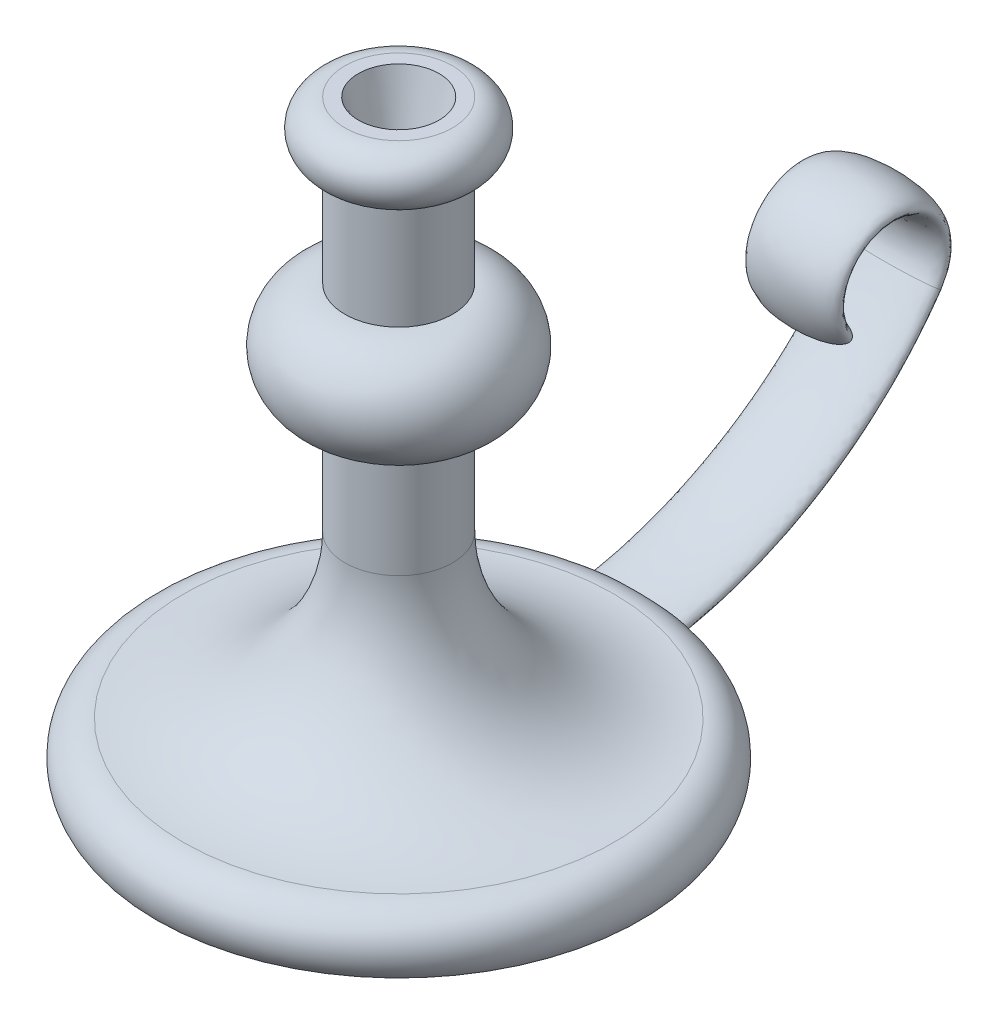
ISO-10303-21;
HEADER;
FILE_DESCRIPTION(('STEP AP214'),'2;1');
FILE_NAME('part.step','',(''),(''),'','','');
FILE_SCHEMA(('AUTOMOTIVE_DESIGN { 1 0 10303 214 1 1 1 1 }'));
ENDSEC;
DATA;
#1=APPLICATION_CONTEXT('core data for automotive mechanical design processes');
#2=APPLICATION_PROTOCOL_DEFINITION('international standard','automotive_design',2000,#1);
#3=PRODUCT_CONTEXT('',#1,'mechanical');
#4=PRODUCT('Part','Part','',(#3));
#5=PRODUCT_RELATED_PRODUCT_CATEGORY('part','',(#4));
#6=PRODUCT_DEFINITION_FORMATION('','',#4);
#7=PRODUCT_DEFINITION_CONTEXT('part definition',#1,'design');
#8=PRODUCT_DEFINITION('design','',#6,#7);
#9=PRODUCT_DEFINITION_SHAPE('','',#8);
#10=(LENGTH_UNIT() NAMED_UNIT(*) SI_UNIT(.MILLI.,.METRE.));
#11=(NAMED_UNIT(*) PLANE_ANGLE_UNIT() SI_UNIT($,.RADIAN.));
#12=(NAMED_UNIT(*) SI_UNIT($,.STERADIAN.) SOLID_ANGLE_UNIT());
#13=UNCERTAINTY_MEASURE_WITH_UNIT(LENGTH_MEASURE(1.E-05),#10,'distance_accuracy_value','');
#14=(GEOMETRIC_REPRESENTATION_CONTEXT(3) GLOBAL_UNCERTAINTY_ASSIGNED_CONTEXT((#13)) GLOBAL_UNIT_ASSIGNED_CONTEXT((#10,
#11,#12)) REPRESENTATION_CONTEXT('',''));
#15=CARTESIAN_POINT('',(0.,0.,0.));
#16=DIRECTION('',(0.,0.,1.));
#17=DIRECTION('',(1.,0.,0.));
#18=AXIS2_PLACEMENT_3D('',#15,#16,#17);
#19=CARTESIAN_POINT('',(0.,7.50000000000003,0.));
#20=DIRECTION('',(0.,-1.,0.));
#21=DIRECTION('',(0.,0.,-1.));
#22=AXIS2_PLACEMENT_3D('',#19,#20,#21);
#23=TOROIDAL_SURFACE('',#22,80.,12.5);
#24=CARTESIAN_POINT('',(0.,0.,0.));
#25=DIRECTION('',(0.,-1.,0.));
#26=DIRECTION('',(0.,0.,-1.));
#27=AXIS2_PLACEMENT_3D('',#24,#25,#26);
#28=CIRCLE('',#27,90.);
#29=CARTESIAN_POINT('',(0.,0.,-90.));
#30=VERTEX_POINT('',#29);
#31=EDGE_CURVE('E10',#30,#30,#28,.T.);
#32=ORIENTED_EDGE('',*,*,#31,.F.);
#33=EDGE_LOOP('',(#32));
#34=FACE_BOUND('',#33,.T.);
#35=CARTESIAN_POINT('',(0.,20.,0.));
#36=DIRECTION('',(0.,-1.,0.));
#37=DIRECTION('',(0.,0.,-1.));
#38=AXIS2_PLACEMENT_3D('',#35,#36,#37);
#39=CIRCLE('',#38,80.);
#40=CARTESIAN_POINT('',(0.,20.,-80.));
#41=VERTEX_POINT('',#40);
#42=EDGE_CURVE('E77',#41,#41,#39,.T.);
#43=ORIENTED_EDGE('',*,*,#42,.T.);
#44=EDGE_LOOP('',(#43));
#45=FACE_BOUND('',#44,.T.);
#46=CARTESIAN_POINT('',(0.,17.6044214647841,-87.3587136689785));
#47=CARTESIAN_POINT('',(-0.593269308948495,17.6044222964712,-87.3587138876715));
#48=CARTESIAN_POINT('',(-1.18654190977612,17.596578327822,-87.3634728135956));
#49=CARTESIAN_POINT('',(-2.37253950191227,17.5649564570587,-87.3824555454085));
#50=CARTESIAN_POINT('',(-2.96526446830341,17.5411778625314,-87.3966797625958));
#51=CARTESIAN_POINT('',(-4.14974371154903,17.4768996134226,-87.4344687150672));
#52=CARTESIAN_POINT('',(-4.74149753135121,17.4363935777278,-87.458037014755));
#53=CARTESIAN_POINT('',(-5.92302093926765,17.3372768303754,-87.514387164802));
#54=CARTESIAN_POINT('',(-6.51279069951558,17.2786677325175,-87.547168193868));
#55=CARTESIAN_POINT('',(-7.60045756089345,17.1515066480329,-87.6163434365485));
#56=CARTESIAN_POINT('',(-8.09876892479468,17.0857959614242,-87.6514428700074));
#57=CARTESIAN_POINT('',(-9.09252295856224,16.9376726268091,-87.7285928861288));
#58=CARTESIAN_POINT('',(-9.58796503175401,16.8552566247176,-87.7706448644066));
#59=CARTESIAN_POINT('',(-10.3277369461521,16.7168625400392,-87.8394498182932));
#60=CARTESIAN_POINT('',(-10.5737278562659,16.6682774084465,-87.8633355201696));
#61=CARTESIAN_POINT('',(-11.0643534037621,16.5656501371418,-87.913178338713));
#62=CARTESIAN_POINT('',(-11.308988107959,16.5116082688264,-87.9391353523475));
#63=CARTESIAN_POINT('',(-11.7964814109535,16.3974489536306,-87.9933261568873));
#64=CARTESIAN_POINT('',(-12.0393406969888,16.3373340074343,-88.0215590097205));
#65=CARTESIAN_POINT('',(-12.5229136134188,16.2101894073718,-88.0806179033031));
#66=CARTESIAN_POINT('',(-12.7636274409107,16.1431603959454,-88.1114437030726));
#67=CARTESIAN_POINT('',(-13.2428483543998,16.0009356172049,-88.1762081025571));
#68=CARTESIAN_POINT('',(-13.481348900149,15.925720969265,-88.2101538693866));
#69=CARTESIAN_POINT('',(-13.954720316881,15.7657619994199,-88.2817498333474));
#70=CARTESIAN_POINT('',(-14.189589844539,15.6810142422932,-88.3194013652228));
#71=CARTESIAN_POINT('',(-14.5379989103469,15.5451903285032,-88.37938251742));
#72=CARTESIAN_POINT('',(-14.653532291571,15.4984445105855,-88.3999693039866));
#73=CARTESIAN_POINT('',(-14.8829808042501,15.4017111209075,-88.4424771050089));
#74=CARTESIAN_POINT('',(-14.9968960773658,15.3517238350873,-88.4643980017681));
#75=CARTESIAN_POINT('',(-15.222673050782,15.2481324871314,-88.5097627195892));
#76=CARTESIAN_POINT('',(-15.3345360922293,15.1945309024566,-88.5332054970591));
#77=CARTESIAN_POINT('',(-15.5557717515151,15.0831863159614,-88.5818808137463));
#78=CARTESIAN_POINT('',(-15.6651448031431,15.0254440428915,-88.6071130380169));
#79=CARTESIAN_POINT('',(-15.8816471798155,14.9046780135687,-88.659920571978));
#80=CARTESIAN_POINT('',(-15.9887496017568,14.8416136108097,-88.6875139418257));
#81=CARTESIAN_POINT('',(-16.1986914200793,14.709865814257,-88.7452747883213));
#82=CARTESIAN_POINT('',(-16.3015326322799,14.6411848517201,-88.7754411514305));
#83=CARTESIAN_POINT('',(-16.5010690614788,14.497528264491,-88.8387651625412));
#84=CARTESIAN_POINT('',(-16.597789590674,14.422582009821,-88.8719089025592));
#85=CARTESIAN_POINT('',(-16.783269025723,14.2650677973101,-88.9419467507977));
#86=CARTESIAN_POINT('',(-16.8720380301309,14.1825097850506,-88.9788359713534));
#87=CARTESIAN_POINT('',(-17.0260155153692,14.0214041662777,-89.0513771976566));
#88=CARTESIAN_POINT('',(-17.092767257069,13.9440660671232,-89.0864068035442));
#89=CARTESIAN_POINT('',(-17.2150427595764,13.7823179207401,-89.1602861995005));
#90=CARTESIAN_POINT('',(-17.2705623138035,13.6979052406778,-89.1991374127383));
#91=CARTESIAN_POINT('',(-17.3425766876906,13.5657077705035,-89.2606176988831));
#92=CARTESIAN_POINT('',(-17.3648233345814,13.5203622492196,-89.2818108265662));
#93=CARTESIAN_POINT('',(-17.4047455157986,13.4281537485805,-89.325151904638));
#94=CARTESIAN_POINT('',(-17.4224237140695,13.3812916715779,-89.3472992897508));
#95=CARTESIAN_POINT('',(-17.4526318189035,13.2864195839361,-89.3924132814225));
#96=CARTESIAN_POINT('',(-17.4651709302373,13.2384117901477,-89.4153783424876));
#97=CARTESIAN_POINT('',(-17.484689670203,13.1416021211334,-89.4619930538826));
#98=CARTESIAN_POINT('',(-17.4916703425603,13.0928003967432,-89.4856425748248));
#99=CARTESIAN_POINT('',(-17.4993320817976,13.0006750776105,-89.5305951148159));
#100=CARTESIAN_POINT('',(-17.5006555503984,12.9573797446966,-89.5518483161149));
#101=CARTESIAN_POINT('',(-17.498740210217,12.87096147074,-89.5945359246165));
#102=CARTESIAN_POINT('',(-17.4954999103254,12.8278385906596,-89.615970388768));
#103=CARTESIAN_POINT('',(-17.4845757385167,12.7421438060355,-89.6588369856127));
#104=CARTESIAN_POINT('',(-17.4768902771956,12.6995721041397,-89.6802691147279));
#105=CARTESIAN_POINT('',(-17.4573259574996,12.6152980025887,-89.7229675152347));
#106=CARTESIAN_POINT('',(-17.4454447866491,12.5735960957738,-89.7442336885395));
#107=CARTESIAN_POINT('',(-17.4153924484241,12.4840623008116,-89.7901834896787));
#108=CARTESIAN_POINT('',(-17.3964810679244,12.4364482106518,-89.8148075084835));
#109=CARTESIAN_POINT('',(-17.3539589549016,12.343038570312,-89.8634712885172));
#110=CARTESIAN_POINT('',(-17.3303448810343,12.2972443410858,-89.8875106206097));
#111=CARTESIAN_POINT('',(-17.2533686672085,12.1627072797899,-89.9586441593314));
#112=CARTESIAN_POINT('',(-17.1938997416176,12.0768857307828,-90.0047149840883));
#113=CARTESIAN_POINT('',(-17.073877936901,11.9263602551536,-90.0865956977717));
#114=CARTESIAN_POINT('',(-17.0150441105848,11.8604819531032,-90.1228627070442));
#115=CARTESIAN_POINT('',(-16.8910854132874,11.7336864233663,-90.193401789512));
#116=CARTESIAN_POINT('',(-16.8259558388493,11.6727729684448,-90.2276723400692));
#117=CARTESIAN_POINT('',(-16.6907993646612,11.5553424028891,-90.2943961502005));
#118=CARTESIAN_POINT('',(-16.6207642168833,11.4988330512332,-90.3268461754803));
#119=CARTESIAN_POINT('',(-16.4769318087255,11.389778829532,-90.3900557092391));
#120=CARTESIAN_POINT('',(-16.4031333771092,11.3372352065042,-90.4208146851513));
#121=CARTESIAN_POINT('',(-16.2240004668957,11.2163797085992,-90.4921864839149));
#122=CARTESIAN_POINT('',(-16.117326225279,11.1496508306002,-90.5321090926178));
#123=CARTESIAN_POINT('',(-15.8997683564191,11.0218326607209,-90.609429999681));
#124=CARTESIAN_POINT('',(-15.7888835763689,10.9607449292767,-90.6468275988166));
#125=CARTESIAN_POINT('',(-15.5639851670184,10.8434568291851,-90.7193718271964));
#126=CARTESIAN_POINT('',(-15.4499742348142,10.7872524117928,-90.7545203146772));
#127=CARTESIAN_POINT('',(-15.2194348821056,10.6790338487034,-90.8228467412258));
#128=CARTESIAN_POINT('',(-15.1029067839245,10.6270191704965,-90.8560249305743));
#129=CARTESIAN_POINT('',(-14.8418337893476,10.5155574477604,-90.927759059896));
#130=CARTESIAN_POINT('',(-14.6967880663915,10.4570079924872,-90.965883209878));
#131=CARTESIAN_POINT('',(-14.4042930558383,10.3446056726496,-91.039807542277));
#132=CARTESIAN_POINT('',(-14.2568434176254,10.2907535006001,-91.0756073818255));
#133=CARTESIAN_POINT('',(-13.959841400602,10.1871023598887,-91.1451529310855));
#134=CARTESIAN_POINT('',(-13.8102866744838,10.1373084197182,-91.178896079719));
#135=CARTESIAN_POINT('',(-13.5095892388169,10.0413761703538,-91.2444675105987));
#136=CARTESIAN_POINT('',(-13.3584464198839,9.99523811486374,-91.2762956599149));
#137=CARTESIAN_POINT('',(-12.9028823055647,9.86166936799714,-91.3691741743649));
#138=CARTESIAN_POINT('',(-12.5964789147607,9.77913663228316,-91.4275831226008));
#139=CARTESIAN_POINT('',(-11.9784795700229,9.62446744718965,-91.5385195641811));
#140=CARTESIAN_POINT('',(-11.6668659742341,9.55238170892173,-91.5910181098038));
#141=CARTESIAN_POINT('',(-11.0410421303076,9.41749718215055,-91.6904140606673));
#142=CARTESIAN_POINT('',(-10.7268342828855,9.35469064449221,-91.7373161332102));
#143=CARTESIAN_POINT('',(-10.0962778372202,9.23711508099558,-91.8260232362975));
#144=CARTESIAN_POINT('',(-9.77992962757948,9.18234463503442,-91.8678291672009));
#145=CARTESIAN_POINT('',(-9.02449480522143,9.06039101929074,-91.9617454532007));
#146=CARTESIAN_POINT('',(-8.58461764627173,8.99644185898727,-92.0117038504465));
#147=CARTESIAN_POINT('',(-7.70231851471795,8.8803919539456,-92.1032480514784));
#148=CARTESIAN_POINT('',(-7.25989577819939,8.82829497898743,-92.1448311908968));
#149=CARTESIAN_POINT('',(-6.37320853085041,8.73476479656318,-92.2200645095008));
#150=CARTESIAN_POINT('',(-5.92894381210006,8.69333282819074,-92.2537137668652));
#151=CARTESIAN_POINT('',(-5.03978962276785,8.62033563775072,-92.3133487252962));
#152=CARTESIAN_POINT('',(-4.59490215944801,8.58875536060186,-92.3393461162631));
#153=CARTESIAN_POINT('',(-3.70426883956079,8.53477846969662,-92.3839658546697));
#154=CARTESIAN_POINT('',(-3.25852311601546,8.51238053239715,-92.4025892649822));
#155=CARTESIAN_POINT('',(-2.36645652123704,8.47636523851908,-92.4326119792048));
#156=CARTESIAN_POINT('',(-1.92013566917945,8.4627475964153,-92.4440115180268));
#157=CARTESIAN_POINT('',(-0.808565378209694,8.43946944223111,-92.463512040388));
#158=CARTESIAN_POINT('',(-0.143120131588403,8.43501098767193,-92.4672651653611));
#159=CARTESIAN_POINT('',(1.18767305376295,8.4448519835737,-92.4590069024403));
#160=CARTESIAN_POINT('',(1.85302093841475,8.45915558320914,-92.4469920274981));
#161=CARTESIAN_POINT('',(3.18285699268514,8.50708310281722,-92.4069839953166));
#162=CARTESIAN_POINT('',(3.84734461868396,8.54071600348182,-92.3789834109096));
#163=CARTESIAN_POINT('',(5.1734176816559,8.62858640709154,-92.3065479156803));
#164=CARTESIAN_POINT('',(5.83500541319909,8.68280251273621,-92.2621300727068));
#165=CARTESIAN_POINT('',(6.82447999855622,8.78138394846561,-92.1825127737378));
#166=CARTESIAN_POINT('',(7.15377265751484,8.81711418641728,-92.1538137052353));
#167=CARTESIAN_POINT('',(7.81119605329484,8.89478344537319,-92.0919133853538));
#168=CARTESIAN_POINT('',(8.13932683783974,8.93672220826339,-92.0587123211464));
#169=CARTESIAN_POINT('',(8.79391861412783,9.02733838983287,-91.9876197478616));
#170=CARTESIAN_POINT('',(9.12038059539381,9.07601117462587,-91.9497314660832));
#171=CARTESIAN_POINT('',(9.77146709446738,9.18084478999023,-91.868969903506));
#172=CARTESIAN_POINT('',(10.096091754791,9.237005031246,-91.8260970150649));
#173=CARTESIAN_POINT('',(10.6607888039264,9.34243345062186,-91.7465709080718));
#174=CARTESIAN_POINT('',(10.9013793791142,9.3898250467998,-91.7111067081797));
#175=CARTESIAN_POINT('',(11.3809881658483,9.48983572658131,-91.6369937513943));
#176=CARTESIAN_POINT('',(11.6200063625021,9.54245485962045,-91.5983449643857));
#177=CARTESIAN_POINT('',(12.0957473598394,9.65349170548547,-91.517667346547));
#178=CARTESIAN_POINT('',(12.3324730035996,9.71190083541507,-91.4756435357854));
#179=CARTESIAN_POINT('',(12.803457889725,9.83541551193611,-91.387841167902));
#180=CARTESIAN_POINT('',(13.0377173639938,9.90052042258323,-91.3420629674438));
#181=CARTESIAN_POINT('',(13.5028612952295,10.0384750578117,-91.2463558175847));
#182=CARTESIAN_POINT('',(13.7337486447242,10.1113176400067,-91.1964307051857));
#183=CARTESIAN_POINT('',(14.1917727195284,10.2664374134345,-91.0917018174198));
#184=CARTESIAN_POINT('',(14.4189014686652,10.3487323000733,-91.036888936126));
#185=CARTESIAN_POINT('',(14.7988740314666,10.4979200780773,-90.9392073185343));
#186=CARTESIAN_POINT('',(14.9532496358664,10.561857011698,-90.897793403248));
#187=CARTESIAN_POINT('',(15.2583376166473,10.6962717913355,-90.8118387431862));
#188=CARTESIAN_POINT('',(15.4090487083536,10.7667518906422,-90.76729692254));
#189=CARTESIAN_POINT('',(15.7050291328021,10.9152981299656,-90.6747356922209));
#190=CARTESIAN_POINT('',(15.8503131027976,10.9933414610846,-90.6267268433968));
#191=CARTESIAN_POINT('',(16.1338341774413,11.1588466734242,-90.5264913052894));
#192=CARTESIAN_POINT('',(16.2720773024056,11.2463003021262,-90.474268321554));
#193=CARTESIAN_POINT('',(16.5138022543953,11.4157748017296,-90.3748150953166));
#194=CARTESIAN_POINT('',(16.6189985235065,11.4958323499463,-90.3284353772185));
#195=CARTESIAN_POINT('',(16.8199151421964,11.6655914608631,-90.2316011173072));
#196=CARTESIAN_POINT('',(16.9156178602293,11.7553103455086,-90.1811392983169));
#197=CARTESIAN_POINT('',(17.0488957045368,11.8989101203504,-90.1017392941908));
#198=CARTESIAN_POINT('',(17.0918856695473,11.9486797713593,-90.0744403211114));
#199=CARTESIAN_POINT('',(17.1732558418673,12.0512866401495,-90.0186557560923));
#200=CARTESIAN_POINT('',(17.2116351813,12.1041244326915,-89.9901699421037));
#201=CARTESIAN_POINT('',(17.2825873527385,12.2127336146096,-89.9321532722059));
#202=CARTESIAN_POINT('',(17.3151810256829,12.2684934971654,-89.9026266461683));
#203=CARTESIAN_POINT('',(17.3734984637988,12.3829527793079,-89.842586571115));
#204=CARTESIAN_POINT('',(17.3992278628282,12.4416497210146,-89.8120739545576));
#205=CARTESIAN_POINT('',(17.4481582913767,12.5771121876124,-89.7423307234238));
#206=CARTESIAN_POINT('',(17.4690076705381,12.6546425746563,-89.7028759986052));
#207=CARTESIAN_POINT('',(17.4957233007233,12.8120879082816,-89.6237131124047));
#208=CARTESIAN_POINT('',(17.5016035246277,12.8920005605874,-89.5840052220816));
#209=CARTESIAN_POINT('',(17.4976382824715,13.0519657191655,-89.5054217462019));
#210=CARTESIAN_POINT('',(17.4877740780329,13.132018278647,-89.4665472082887));
#211=CARTESIAN_POINT('',(17.4532981323472,13.2898213018103,-89.3907034991651));
#212=CARTESIAN_POINT('',(17.4286713878002,13.3675693389096,-89.3537363079761));
#213=CARTESIAN_POINT('',(17.3567602378274,13.5439565035962,-89.2706199636383));
#214=CARTESIAN_POINT('',(17.3046925810347,13.6410789109329,-89.2254384836941));
#215=CARTESIAN_POINT('',(17.184288903004,13.8271124825582,-89.1397048052884));
#216=CARTESIAN_POINT('',(17.1158926950495,13.9159915381337,-89.0991705746363));
#217=CARTESIAN_POINT('',(16.9774646137458,14.0744514386948,-89.0274244481777));
#218=CARTESIAN_POINT('',(16.908821687161,14.1450349065205,-88.9956869960502));
#219=CARTESIAN_POINT('',(16.7652796454622,14.2805414843979,-88.9350560553002));
#220=CARTESIAN_POINT('',(16.690390114702,14.3454729646357,-88.9061583527377));
#221=CARTESIAN_POINT('',(16.5355926704581,14.4706480400762,-88.8506525874512));
#222=CARTESIAN_POINT('',(16.455669040254,14.5308754902618,-88.8240523796694));
#223=CARTESIAN_POINT('',(16.2921160942645,14.6470326176242,-88.7728821593233));
#224=CARTESIAN_POINT('',(16.208485535828,14.7029608361522,-88.7483128355889));
#225=CARTESIAN_POINT('',(16.0398182788625,14.8100887107037,-88.7013276564359));
#226=CARTESIAN_POINT('',(15.954830971772,14.8613534551093,-88.6788818886335));
#227=CARTESIAN_POINT('',(15.782616335134,14.9606458116504,-88.6354421605399));
#228=CARTESIAN_POINT('',(15.6953886311044,15.0086728776812,-88.6144484451535));
#229=CARTESIAN_POINT('',(15.430765085264,15.1485627952127,-88.5533018690725));
#230=CARTESIAN_POINT('',(15.2506413451647,15.2361027324591,-88.5150411247205));
#231=CARTESIAN_POINT('',(14.885317368211,15.4019082726467,-88.4424081062455));
#232=CARTESIAN_POINT('',(14.7001132437837,15.4801665147437,-88.4080389192864));
#233=CARTESIAN_POINT('',(14.3252271364473,15.6292585608196,-88.3422928888632));
#234=CARTESIAN_POINT('',(14.1355284983949,15.7000566271095,-88.3109305087226));
#235=CARTESIAN_POINT('',(13.7535891886166,15.8349286092398,-88.2508502317638));
#236=CARTESIAN_POINT('',(13.5613513723908,15.899009456416,-88.2221296128026));
#237=CARTESIAN_POINT('',(13.1747979853187,16.0214087539988,-88.1669013046514));
#238=CARTESIAN_POINT('',(12.9804829188252,16.0797285694729,-88.1403930914672));
#239=CARTESIAN_POINT('',(12.5311046407331,16.2082072829167,-88.0815495169484));
#240=CARTESIAN_POINT('',(12.2754527029734,16.276608175269,-88.0498782865772));
#241=CARTESIAN_POINT('',(11.7619484433438,16.4060277051611,-87.9893000381041));
#242=CARTESIAN_POINT('',(11.504095878554,16.467045516122,-87.9603933295825));
#243=CARTESIAN_POINT('',(10.98654975168,16.5826065750708,-87.9050141104263));
#244=CARTESIAN_POINT('',(10.726855312623,16.6371464838912,-87.878542856768));
#245=CARTESIAN_POINT('',(10.206089709729,16.7404024166906,-87.8278317841175));
#246=CARTESIAN_POINT('',(9.94501847652562,16.7891181442483,-87.8035920787142));
#247=CARTESIAN_POINT('',(9.16166243131239,16.9271062707863,-87.734117809456));
#248=CARTESIAN_POINT('',(8.63771329478794,17.008551641992,-87.6919676649669));
#249=CARTESIAN_POINT('',(7.58699283605868,17.1536689269158,-87.6152751598811));
#250=CARTESIAN_POINT('',(7.06022222678349,17.2173451328671,-87.5807309624548));
#251=CARTESIAN_POINT('',(5.9908366900257,17.3304891803936,-87.5182384631685));
#252=CARTESIAN_POINT('',(5.4481668073887,17.3795431981103,-87.4904856585695));
#253=CARTESIAN_POINT('',(4.36131951638248,17.4626842442258,-87.4427841315954));
#254=CARTESIAN_POINT('',(3.81714201587126,17.496770336565,-87.4228358973086));
#255=CARTESIAN_POINT('',(2.72768733988378,17.5509554358495,-87.3908452806274));
#256=CARTESIAN_POINT('',(2.18240986551715,17.5710499126267,-87.3788054588691));
#257=CARTESIAN_POINT('',(1.09142251659916,17.5977824096771,-87.3627396328058));
#258=CARTESIAN_POINT('',(0.545712650937338,17.6044206997653,-87.3587134678161));
#259=CARTESIAN_POINT('',(0.,17.6044214647841,-87.3587136689785));
#260=B_SPLINE_CURVE_WITH_KNOTS('',3,(#46,#47,#48,#49,#50,#51,#52,#53,#54,#55,#56,#57,#58,#59,
#60,#61,#62,#63,#64,#65,#66,#67,#68,#69,#70,#71,#72,#73,#74,#75,#76,#77,#78,#79,#80,#81,#82,#83,
#84,#85,#86,#87,#88,#89,#90,#91,#92,#93,#94,#95,#96,#97,#98,#99,#100,#101,#102,#103,#104,#105,
#106,#107,#108,#109,#110,#111,#112,#113,#114,#115,#116,#117,#118,#119,#120,#121,#122,#123,#124,
#125,#126,#127,#128,#129,#130,#131,#132,#133,#134,#135,#136,#137,#138,#139,#140,#141,#142,#143,
#144,#145,#146,#147,#148,#149,#150,#151,#152,#153,#154,#155,#156,#157,#158,#159,#160,#161,#162,
#163,#164,#165,#166,#167,#168,#169,#170,#171,#172,#173,#174,#175,#176,#177,#178,#179,#180,#181,
#182,#183,#184,#185,#186,#187,#188,#189,#190,#191,#192,#193,#194,#195,#196,#197,#198,#199,#200,
#201,#202,#203,#204,#205,#206,#207,#208,#209,#210,#211,#212,#213,#214,#215,#216,#217,#218,#219,
#220,#221,#222,#223,#224,#225,#226,#227,#228,#229,#230,#231,#232,#233,#234,#235,#236,#237,#238,
#239,#240,#241,#242,#243,#244,#245,#246,#247,#248,#249,#250,#251,#252,#253,#254,#255,#256,#257,
#258,#259),.UNSPECIFIED.,.T.,.F.,(4,2,2,2,2,2,2,2,2,2,2,2,2,2,2,2,2,2,2,2,2,2,2,2,2,2,2,2,2,2,2,
2,2,2,2,2,2,2,2,2,2,2,2,2,2,2,2,2,2,2,2,2,2,2,2,2,2,2,2,2,2,2,2,2,2,2,2,2,2,2,2,2,2,2,2,2,2,2,2,
2,2,2,2,2,2,2,2,2,2,2,2,2,2,2,2,2,2,2,2,2,2,2,2,2,2,2,4),(0.,1.77974207040263,3.55956148161336,
5.34006047889144,7.12040079916607,8.6316793673165,10.1432616703439,10.8988392656438,
11.6543792999727,12.4096094872826,13.1647695633754,13.9217099325307,14.6789239415128,
15.0578395232341,15.4367217249623,15.8153468072166,16.1939054152065,16.5756752384182,
16.9572806697883,17.3371880276656,17.7166058462932,18.0399684375501,18.3634519084619,
18.5275941730166,18.6916405061922,18.8553917133184,19.0191121651157,19.1636455153222,
19.3082260995296,19.4528584117042,19.597570563063,19.7678350424085,19.9382209319908,
20.2792573502608,20.5653356488501,20.8516293486972,21.1384165340641,21.4252935267356,
21.8210368012664,22.216889219177,22.6124102409031,23.0078809128943,23.4907428072773,
23.9736757695286,24.4571983057936,24.9407543672484,25.9083643080074,26.880524216866,
27.8518676194819,28.823039160853,30.1646481620439,31.506683289027,32.8488742675216,
34.1890039839233,35.528940465964,36.8688333726029,38.8647678128661,40.8611437227343,
42.8584479304228,44.8536814978284,45.8510081009905,46.8482932528002,47.8448955242601,
48.8414194023551,49.5846452162714,50.3278780593661,51.0700251822986,51.8121018833965,
52.5534994546391,53.2963083214196,53.812601378717,54.3290728976787,54.8440326573535,
55.3585444392805,55.7783452866219,56.1989117435447,56.4123526208701,56.6258336122859,
56.8385292742317,57.0510498252248,57.3182213134427,57.5851433202166,57.8523832436553,
58.1198952269531,58.4751915748502,58.8318183272556,59.1417100675247,59.4511347824262,
59.7615786569834,60.0721273986654,60.3773010889616,60.6825261253012,61.2937438434276,
61.9054430914666,62.5199508477709,63.1338181336583,63.7475396139727,64.5469825137027,
65.346514833074,66.1464575154061,66.9464408934431,68.541713850329,70.1366011266098,
71.7730793600376,73.409659920479,75.046770122544,76.6838474979867),.UNSPECIFIED.);
#261=CARTESIAN_POINT('',(0.,17.6044214647841,-87.3587136689785));
#262=VERTEX_POINT('',#261);
#263=EDGE_CURVE('E45',#262,#262,#260,.T.);
#264=ORIENTED_EDGE('',*,*,#263,.T.);
#265=EDGE_LOOP('',(#264));
#266=FACE_BOUND('',#265,.T.);
#267=ADVANCED_FACE('F41',(#34,#45,#266),#23,.T.);
#268=CARTESIAN_POINT('',(90.,0.,0.));
#269=DIRECTION('',(0.,-1.,0.));
#270=DIRECTION('',(0.,0.,-1.));
#271=AXIS2_PLACEMENT_3D('',#268,#269,#270);
#272=PLANE('',#271);
#273=ORIENTED_EDGE('',*,*,#31,.T.);
#274=EDGE_LOOP('',(#273));
#275=FACE_BOUND('',#274,.T.);
#276=ADVANCED_FACE('F104',(#275),#272,.T.);
#277=CARTESIAN_POINT('',(0.,220.,0.));
#278=DIRECTION('',(0.,1.,0.));
#279=DIRECTION('',(0.,0.,1.));
#280=AXIS2_PLACEMENT_3D('',#277,#278,#279);
#281=PLANE('',#280);
#282=CARTESIAN_POINT('',(0.,220.,0.));
#283=DIRECTION('',(0.,1.,0.));
#284=DIRECTION('',(0.,0.,1.));
#285=AXIS2_PLACEMENT_3D('',#282,#283,#284);
#286=CIRCLE('',#285,15.);
#287=CARTESIAN_POINT('',(0.,220.,15.));
#288=VERTEX_POINT('',#287);
#289=EDGE_CURVE('E93',#288,#288,#286,.T.);
#290=ORIENTED_EDGE('',*,*,#289,.F.);
#291=EDGE_LOOP('',(#290));
#292=FACE_BOUND('',#291,.T.);
#293=CARTESIAN_POINT('',(0.,220.,0.));
#294=DIRECTION('',(0.,-1.,0.));
#295=DIRECTION('',(0.,0.,-1.));
#296=AXIS2_PLACEMENT_3D('',#293,#294,#295);
#297=CIRCLE('',#296,20.);
#298=CARTESIAN_POINT('',(0.,220.,-20.));
#299=VERTEX_POINT('',#298);
#300=EDGE_CURVE('E54',#299,#299,#297,.T.);
#301=ORIENTED_EDGE('',*,*,#300,.F.);
#302=EDGE_LOOP('',(#301));
#303=FACE_BOUND('',#302,.T.);
#304=ADVANCED_FACE('F100',(#292,#303),#281,.T.);
#305=CARTESIAN_POINT('',(0.,210.,0.));
#306=DIRECTION('',(0.,-1.,0.));
#307=DIRECTION('',(0.,0.,-1.));
#308=AXIS2_PLACEMENT_3D('',#305,#306,#307);
#309=TOROIDAL_SURFACE('',#308,20.,10.);
#310=ORIENTED_EDGE('',*,*,#300,.T.);
#311=EDGE_LOOP('',(#310));
#312=FACE_BOUND('',#311,.T.);
#313=CARTESIAN_POINT('',(0.,200.,0.));
#314=DIRECTION('',(0.,-1.,0.));
#315=DIRECTION('',(0.,0.,-1.));
#316=AXIS2_PLACEMENT_3D('',#313,#314,#315);
#317=CIRCLE('',#316,20.);
#318=CARTESIAN_POINT('',(0.,200.,-20.));
#319=VERTEX_POINT('',#318);
#320=EDGE_CURVE('E59',#319,#319,#317,.T.);
#321=ORIENTED_EDGE('',*,*,#320,.F.);
#322=EDGE_LOOP('',(#321));
#323=FACE_BOUND('',#322,.T.);
#324=ADVANCED_FACE('F103',(#312,#323),#309,.T.);
#325=CARTESIAN_POINT('',(0.,0.,0.));
#326=DIRECTION('',(0.,-1.,0.));
#327=DIRECTION('',(0.,0.,-1.));
#328=AXIS2_PLACEMENT_3D('',#325,#326,#327);
#329=CYLINDRICAL_SURFACE('',#328,20.);
#330=ORIENTED_EDGE('',*,*,#320,.T.);
#331=EDGE_LOOP('',(#330));
#332=FACE_BOUND('',#331,.T.);
#333=CARTESIAN_POINT('',(0.,160.,0.));
#334=DIRECTION('',(0.,-1.,0.));
#335=DIRECTION('',(0.,0.,-1.));
#336=AXIS2_PLACEMENT_3D('',#333,#334,#335);
#337=CIRCLE('',#336,20.);
#338=CARTESIAN_POINT('',(0.,160.,-20.));
#339=VERTEX_POINT('',#338);
#340=EDGE_CURVE('E65',#339,#339,#337,.T.);
#341=ORIENTED_EDGE('',*,*,#340,.F.);
#342=EDGE_LOOP('',(#341));
#343=FACE_BOUND('',#342,.T.);
#344=ADVANCED_FACE('F110',(#332,#343),#329,.T.);
#345=CARTESIAN_POINT('',(0.,140.,0.));
#346=DIRECTION('',(0.,-1.,0.));
#347=DIRECTION('',(0.,0.,-1.));
#348=AXIS2_PLACEMENT_3D('',#345,#346,#347);
#349=DEGENERATE_TOROIDAL_SURFACE('',#348,20.,20.,.T.);
#350=ORIENTED_EDGE('',*,*,#340,.T.);
#351=EDGE_LOOP('',(#350));
#352=FACE_BOUND('',#351,.T.);
#353=CARTESIAN_POINT('',(0.,120.,0.));
#354=DIRECTION('',(0.,-1.,0.));
#355=DIRECTION('',(0.,0.,-1.));
#356=AXIS2_PLACEMENT_3D('',#353,#354,#355);
#357=CIRCLE('',#356,20.);
#358=CARTESIAN_POINT('',(0.,120.,-20.));
#359=VERTEX_POINT('',#358);
#360=EDGE_CURVE('E69',#359,#359,#357,.T.);
#361=ORIENTED_EDGE('',*,*,#360,.F.);
#362=EDGE_LOOP('',(#361));
#363=FACE_BOUND('',#362,.T.);
#364=ADVANCED_FACE('F116',(#352,#363),#349,.T.);
#365=CARTESIAN_POINT('',(0.,0.,0.));
#366=DIRECTION('',(0.,-1.,0.));
#367=DIRECTION('',(0.,0.,-1.));
#368=AXIS2_PLACEMENT_3D('',#365,#366,#367);
#369=CYLINDRICAL_SURFACE('',#368,20.);
#370=ORIENTED_EDGE('',*,*,#360,.T.);
#371=EDGE_LOOP('',(#370));
#372=FACE_BOUND('',#371,.T.);
#373=CARTESIAN_POINT('',(0.,80.,0.));
#374=DIRECTION('',(0.,-1.,0.));
#375=DIRECTION('',(0.,0.,-1.));
#376=AXIS2_PLACEMENT_3D('',#373,#374,#375);
#377=CIRCLE('',#376,20.);
#378=CARTESIAN_POINT('',(0.,80.,-20.));
#379=VERTEX_POINT('',#378);
#380=EDGE_CURVE('E73',#379,#379,#377,.T.);
#381=ORIENTED_EDGE('',*,*,#380,.F.);
#382=EDGE_LOOP('',(#381));
#383=FACE_BOUND('',#382,.T.);
#384=ADVANCED_FACE('F122',(#372,#383),#369,.T.);
#385=CARTESIAN_POINT('',(0.,80.,0.));
#386=DIRECTION('',(0.,-1.,0.));
#387=DIRECTION('',(0.,0.,-1.));
#388=AXIS2_PLACEMENT_3D('',#385,#386,#387);
#389=TOROIDAL_SURFACE('',#388,80.,60.);
#390=ORIENTED_EDGE('',*,*,#380,.T.);
#391=EDGE_LOOP('',(#390));
#392=FACE_BOUND('',#391,.T.);
#393=ORIENTED_EDGE('',*,*,#42,.F.);
#394=EDGE_LOOP('',(#393));
#395=FACE_BOUND('',#394,.T.);
#396=ADVANCED_FACE('F128',(#392,#395),#389,.F.);
#397=CARTESIAN_POINT('',(0.,75.,-150.634185358261));
#398=DIRECTION('',(0.,0.823947139620552,0.566666666666667));
#399=DIRECTION('',(1.,0.,0.));
#400=AXIS2_PLACEMENT_3D('',#397,#398,#399);
#401=PLANE('',#400);
#402=CARTESIAN_POINT('',(0.,75.,-150.634185358261));
#403=DIRECTION('',(0.,0.823947139620552,0.566666666666667));
#404=DIRECTION('',(-1.,0.,0.));
#405=AXIS2_PLACEMENT_3D('',#402,#403,#404);
#406=ELLIPSE('',#405,17.5,5.);
#407=CARTESIAN_POINT('',(-17.5,75.,-150.634185358261));
#408=VERTEX_POINT('',#407);
#409=EDGE_CURVE('E81',#408,#408,#406,.T.);
#410=ORIENTED_EDGE('',*,*,#409,.F.);
#411=EDGE_LOOP('',(#410));
#412=FACE_BOUND('',#411,.T.);
#413=ADVANCED_FACE('F134',(#412),#401,.F.);
#414=CARTESIAN_POINT('',(-17.5,10.,-60.));
#415=CARTESIAN_POINT('',(-17.5,10.,-110.410191303973));
#416=CARTESIAN_POINT('',(-17.5,33.4646670673665,-155.026295870831));
#417=CARTESIAN_POINT('',(-17.5,75.,-183.592070943083));
#418=CARTESIAN_POINT('',(-17.5,0.,-60.));
#419=CARTESIAN_POINT('',(-17.5,0.,-113.770870724238));
#420=CARTESIAN_POINT('',(-17.5,25.0289782051909,-161.36138226222));
#421=CARTESIAN_POINT('',(-17.5,69.3333333333333,-191.831542339288));
#422=CARTESIAN_POINT('',(17.5,0.,-60.));
#423=CARTESIAN_POINT('',(17.5,0.,-113.770870724238));
#424=CARTESIAN_POINT('',(17.5,25.0289782051909,-161.36138226222));
#425=CARTESIAN_POINT('',(17.5,69.3333333333333,-191.831542339288));
#426=CARTESIAN_POINT('',(17.5,10.,-60.));
#427=CARTESIAN_POINT('',(17.5,10.,-110.410191303973));
#428=CARTESIAN_POINT('',(17.5,33.4646670673665,-155.026295870831));
#429=CARTESIAN_POINT('',(17.5,75.,-183.592070943083));
#430=CARTESIAN_POINT('',(17.5,20.,-60.));
#431=CARTESIAN_POINT('',(17.5,20.,-107.049511883708));
#432=CARTESIAN_POINT('',(17.5,41.9003559295421,-148.691209479443));
#433=CARTESIAN_POINT('',(17.5,80.6666666666666,-175.352599546877));
#434=CARTESIAN_POINT('',(-17.5,20.,-60.));
#435=CARTESIAN_POINT('',(-17.5,20.,-107.049511883708));
#436=CARTESIAN_POINT('',(-17.5,41.9003559295421,-148.691209479443));
#437=CARTESIAN_POINT('',(-17.5,80.6666666666666,-175.352599546877));
#438=CARTESIAN_POINT('',(-17.5,10.,-60.));
#439=CARTESIAN_POINT('',(-17.5,10.,-110.410191303973));
#440=CARTESIAN_POINT('',(-17.5,33.4646670673665,-155.026295870831));
#441=CARTESIAN_POINT('',(-17.5,75.,-183.592070943083));
#442=(BOUNDED_SURFACE() B_SPLINE_SURFACE(3,3,((#414,#415,#416,#417),(#418,#419,#420,#421),(#422,
#423,#424,#425),(#426,#427,#428,#429),(#430,#431,#432,#433),(#434,#435,#436,#437),(#438,#439,
#440,#441)),.UNSPECIFIED.,.T.,.F.,.F.) B_SPLINE_SURFACE_WITH_KNOTS((4,3,4),(4,4),(0.,0.5,1.),
(0.,1.),.UNSPECIFIED.) GEOMETRIC_REPRESENTATION_ITEM() RATIONAL_B_SPLINE_SURFACE(((1.,
0.923374135437856,0.923374135437856,1.),(0.333333333333333,0.307791378479285,0.307791378479285,
0.333333333333333),(0.333333333333333,0.307791378479285,0.307791378479285,0.333333333333333),
(1.,0.923374135437856,0.923374135437856,1.),(0.333333333333333,0.307791378479285,
0.307791378479285,0.333333333333333),(0.333333333333333,0.307791378479285,0.307791378479285,
0.333333333333333),(1.,0.923374135437856,0.923374135437856,1.))) REPRESENTATION_ITEM('') SURFACE());
#443=CARTESIAN_POINT('',(0.,75.,-183.592070943083));
#444=DIRECTION('',(0.,-0.823947139620552,0.566666666666667));
#445=DIRECTION('',(-1.,0.,0.));
#446=AXIS2_PLACEMENT_3D('',#443,#444,#445);
#447=ELLIPSE('',#446,17.5,5.);
#448=CARTESIAN_POINT('',(-17.5,75.,-183.592070943083));
#449=VERTEX_POINT('',#448);
#450=EDGE_CURVE('E85',#449,#449,#447,.T.);
#451=ORIENTED_EDGE('',*,*,#263,.F.);
#452=EDGE_LOOP('',(#451));
#453=FACE_BOUND('',#452,.T.);
#454=ORIENTED_EDGE('',*,*,#450,.T.);
#455=EDGE_LOOP('',(#454));
#456=FACE_BOUND('',#455,.T.);
#457=ADVANCED_FACE('F146',(#453,#456),#442,.F.);
#458=CARTESIAN_POINT('',(-17.5,75.,-183.592070943083));
#459=CARTESIAN_POINT('',(-17.5,90.10642735238,-193.981461744242));
#460=CARTESIAN_POINT('',(-17.5,106.333333333333,-185.447347211541));
#461=CARTESIAN_POINT('',(-17.5,106.333333333333,-167.113128150672));
#462=CARTESIAN_POINT('',(-17.5,106.333333333333,-148.778909089802));
#463=CARTESIAN_POINT('',(-17.5,90.1064273523801,-140.244794557101));
#464=CARTESIAN_POINT('',(-17.5,75.,-150.634185358261));
#465=CARTESIAN_POINT('',(-17.5,69.3333333333333,-191.831542339288));
#466=CARTESIAN_POINT('',(-17.5,91.9929743619034,-207.415628541027));
#467=CARTESIAN_POINT('',(-17.5,116.333333333333,-194.614456741976));
#468=CARTESIAN_POINT('',(-17.5,116.333333333333,-167.113128150672));
#469=CARTESIAN_POINT('',(-17.5,116.333333333333,-139.611799559367));
#470=CARTESIAN_POINT('',(-17.5,91.9929743619035,-126.810627760316));
#471=CARTESIAN_POINT('',(-17.5,69.3333333333334,-142.394713962055));
#472=CARTESIAN_POINT('',(17.5,69.3333333333333,-191.831542339288));
#473=CARTESIAN_POINT('',(17.5,91.9929743619034,-207.415628541027));
#474=CARTESIAN_POINT('',(17.5,116.333333333333,-194.614456741976));
#475=CARTESIAN_POINT('',(17.5,116.333333333333,-167.113128150672));
#476=CARTESIAN_POINT('',(17.5,116.333333333333,-139.611799559367));
#477=CARTESIAN_POINT('',(17.5,91.9929743619035,-126.810627760316));
#478=CARTESIAN_POINT('',(17.5,69.3333333333334,-142.394713962055));
#479=CARTESIAN_POINT('',(17.5,75.,-183.592070943083));
#480=CARTESIAN_POINT('',(17.5,90.10642735238,-193.981461744242));
#481=CARTESIAN_POINT('',(17.5,106.333333333333,-185.447347211541));
#482=CARTESIAN_POINT('',(17.5,106.333333333333,-167.113128150672));
#483=CARTESIAN_POINT('',(17.5,106.333333333333,-148.778909089802));
#484=CARTESIAN_POINT('',(17.5,90.1064273523801,-140.244794557101));
#485=CARTESIAN_POINT('',(17.5,75.,-150.634185358261));
#486=CARTESIAN_POINT('',(17.5,80.6666666666667,-175.352599546877));
#487=CARTESIAN_POINT('',(17.5,88.2198803428567,-180.547294947457));
#488=CARTESIAN_POINT('',(17.5,96.3333333333333,-176.280237681107));
#489=CARTESIAN_POINT('',(17.5,96.3333333333333,-167.113128150672));
#490=CARTESIAN_POINT('',(17.5,96.3333333333334,-157.946018620237));
#491=CARTESIAN_POINT('',(17.5,88.2198803428568,-153.678961353887));
#492=CARTESIAN_POINT('',(17.5,80.6666666666667,-158.873656754466));
#493=CARTESIAN_POINT('',(-17.5,80.6666666666667,-175.352599546877));
#494=CARTESIAN_POINT('',(-17.5,88.2198803428567,-180.547294947457));
#495=CARTESIAN_POINT('',(-17.5,96.3333333333333,-176.280237681107));
#496=CARTESIAN_POINT('',(-17.5,96.3333333333333,-167.113128150672));
#497=CARTESIAN_POINT('',(-17.5,96.3333333333334,-157.946018620237));
#498=CARTESIAN_POINT('',(-17.5,88.2198803428568,-153.678961353887));
#499=CARTESIAN_POINT('',(-17.5,80.6666666666667,-158.873656754466));
#500=CARTESIAN_POINT('',(-17.5,75.,-183.592070943083));
#501=CARTESIAN_POINT('',(-17.5,90.10642735238,-193.981461744242));
#502=CARTESIAN_POINT('',(-17.5,106.333333333333,-185.447347211541));
#503=CARTESIAN_POINT('',(-17.5,106.333333333333,-167.113128150672));
#504=CARTESIAN_POINT('',(-17.5,106.333333333333,-148.778909089802));
#505=CARTESIAN_POINT('',(-17.5,90.1064273523801,-140.244794557101));
#506=CARTESIAN_POINT('',(-17.5,75.,-150.634185358261));
#507=(BOUNDED_SURFACE() B_SPLINE_SURFACE(3,3,((#458,#459,#460,#461,#462,#463,#464),(#465,#466,
#467,#468,#469,#470,#471),(#472,#473,#474,#475,#476,#477,#478),(#479,#480,#481,#482,#483,#484,
#485),(#486,#487,#488,#489,#490,#491,#492),(#493,#494,#495,#496,#497,#498,#499),(#500,#501,#502,
#503,#504,#505,#506)),.UNSPECIFIED.,.T.,.F.,.F.) B_SPLINE_SURFACE_WITH_KNOTS((4,3,4),(4,3,4),
(0.,0.5,1.),(0.,0.5,1.),
.UNSPECIFIED.) GEOMETRIC_REPRESENTATION_ITEM() RATIONAL_B_SPLINE_SURFACE(((1.,0.64364977875042,
0.64364977875042,1.,0.64364977875042,0.64364977875042,1.),(0.333333333333333,0.21454992625014,
0.21454992625014,0.333333333333333,0.21454992625014,0.21454992625014,0.333333333333333),
(0.333333333333333,0.21454992625014,0.21454992625014,0.333333333333333,0.21454992625014,
0.21454992625014,0.333333333333333),(1.,0.64364977875042,0.64364977875042,1.,0.64364977875042,
0.64364977875042,1.),(0.333333333333333,0.21454992625014,0.21454992625014,0.333333333333333,
0.21454992625014,0.21454992625014,0.333333333333333),(0.333333333333333,0.21454992625014,
0.21454992625014,0.333333333333333,0.21454992625014,0.21454992625014,0.333333333333333),(1.,
0.64364977875042,0.64364977875042,1.,0.64364977875042,0.64364977875042,1.))) REPRESENTATION_ITEM('') SURFACE());
#508=ORIENTED_EDGE('',*,*,#409,.T.);
#509=EDGE_LOOP('',(#508));
#510=FACE_BOUND('',#509,.T.);
#511=ORIENTED_EDGE('',*,*,#450,.F.);
#512=EDGE_LOOP('',(#511));
#513=FACE_BOUND('',#512,.T.);
#514=ADVANCED_FACE('F136',(#510,#513),#507,.F.);
#515=CARTESIAN_POINT('',(0.,220.,0.));
#516=DIRECTION('',(0.,1.,0.));
#517=DIRECTION('',(0.,0.,1.));
#518=AXIS2_PLACEMENT_3D('',#515,#516,#517);
#519=CONICAL_SURFACE('',#518,15.,0.26179938779915);
#520=CARTESIAN_POINT('',(0.,195.,0.));
#521=DIRECTION('',(0.,1.,0.));
#522=DIRECTION('',(0.,0.,1.));
#523=AXIS2_PLACEMENT_3D('',#520,#521,#522);
#524=CIRCLE('',#523,8.30127018922192);
#525=CARTESIAN_POINT('',(0.,195.,8.30127018922192));
#526=VERTEX_POINT('',#525);
#527=EDGE_CURVE('E89',#526,#526,#524,.T.);
#528=ORIENTED_EDGE('',*,*,#527,.F.);
#529=EDGE_LOOP('',(#528));
#530=FACE_BOUND('',#529,.T.);
#531=ORIENTED_EDGE('',*,*,#289,.T.);
#532=EDGE_LOOP('',(#531));
#533=FACE_BOUND('',#532,.T.);
#534=ADVANCED_FACE('F98',(#530,#533),#519,.F.);
#535=CARTESIAN_POINT('',(0.,195.,0.));
#536=DIRECTION('',(0.,1.,0.));
#537=DIRECTION('',(0.,0.,1.));
#538=AXIS2_PLACEMENT_3D('',#535,#536,#537);
#539=PLANE('',#538);
#540=ORIENTED_EDGE('',*,*,#527,.T.);
#541=EDGE_LOOP('',(#540));
#542=FACE_BOUND('',#541,.T.);
#543=ADVANCED_FACE('F157',(#542),#539,.T.);
#544=CLOSED_SHELL('',(#267,#276,#304,#324,#344,#364,#384,#396,#413,#457,#514,#534,#543));
#545=MANIFOLD_SOLID_BREP('B2',#544);
#546=ADVANCED_BREP_SHAPE_REPRESENTATION('',(#18,#545),#14);
#547=SHAPE_DEFINITION_REPRESENTATION(#9,#546);
ENDSEC;
END-ISO-10303-21;
